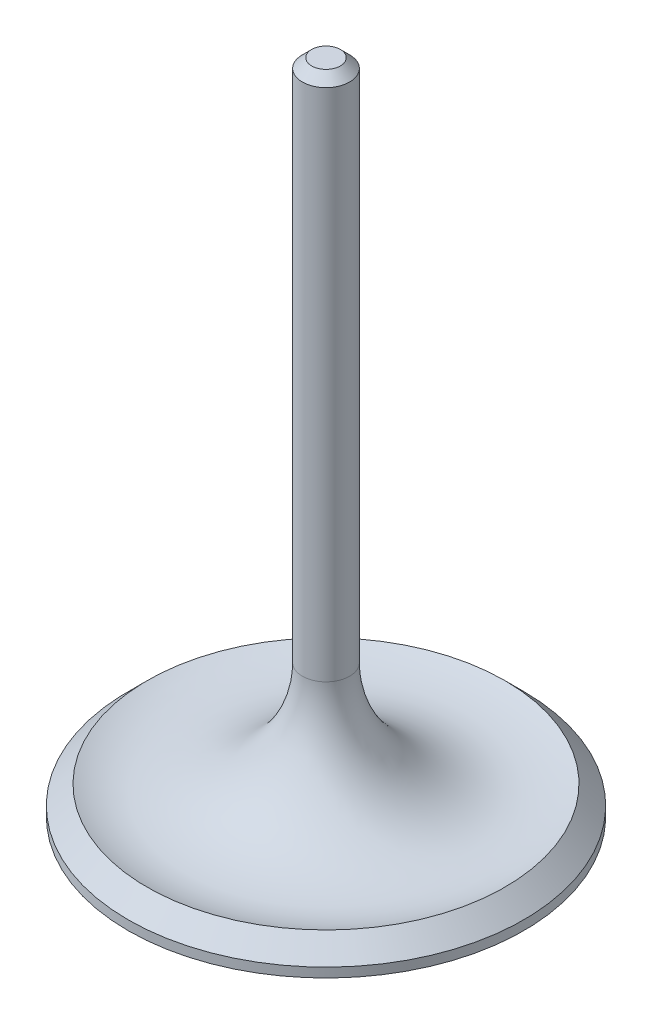
ISO-10303-21;
HEADER;
FILE_DESCRIPTION(('STEP AP214'),'2;1');
FILE_NAME('part.step','',(''),(''),'','','');
FILE_SCHEMA(('AUTOMOTIVE_DESIGN { 1 0 10303 214 1 1 1 1 }'));
ENDSEC;
DATA;
#1=APPLICATION_CONTEXT('core data for automotive mechanical design processes');
#2=APPLICATION_PROTOCOL_DEFINITION('international standard','automotive_design',2000,#1);
#3=PRODUCT_CONTEXT('',#1,'mechanical');
#4=PRODUCT('Part','Part','',(#3));
#5=PRODUCT_RELATED_PRODUCT_CATEGORY('part','',(#4));
#6=PRODUCT_DEFINITION_FORMATION('','',#4);
#7=PRODUCT_DEFINITION_CONTEXT('part definition',#1,'design');
#8=PRODUCT_DEFINITION('design','',#6,#7);
#9=PRODUCT_DEFINITION_SHAPE('','',#8);
#10=(LENGTH_UNIT() NAMED_UNIT(*) SI_UNIT(.MILLI.,.METRE.));
#11=(NAMED_UNIT(*) PLANE_ANGLE_UNIT() SI_UNIT($,.RADIAN.));
#12=(NAMED_UNIT(*) SI_UNIT($,.STERADIAN.) SOLID_ANGLE_UNIT());
#13=UNCERTAINTY_MEASURE_WITH_UNIT(LENGTH_MEASURE(1.E-05),#10,'distance_accuracy_value','');
#14=(GEOMETRIC_REPRESENTATION_CONTEXT(3) GLOBAL_UNCERTAINTY_ASSIGNED_CONTEXT((#13)) GLOBAL_UNIT_ASSIGNED_CONTEXT((#10,
#11,#12)) REPRESENTATION_CONTEXT('',''));
#15=CARTESIAN_POINT('',(0.,0.,0.));
#16=DIRECTION('',(0.,0.,1.));
#17=DIRECTION('',(1.,0.,0.));
#18=AXIS2_PLACEMENT_3D('',#15,#16,#17);
#19=CARTESIAN_POINT('',(0.,0.,-26.65));
#20=DIRECTION('',(0.,-1.,0.));
#21=DIRECTION('',(0.,0.,-1.));
#22=AXIS2_PLACEMENT_3D('',#19,#20,#21);
#23=PLANE('',#22);
#24=CARTESIAN_POINT('',(0.,0.,0.));
#25=DIRECTION('',(0.,-1.,0.));
#26=DIRECTION('',(0.,0.,-1.));
#27=AXIS2_PLACEMENT_3D('',#24,#25,#26);
#28=CIRCLE('',#27,26.65);
#29=CARTESIAN_POINT('',(0.,0.,-26.65));
#30=VERTEX_POINT('',#29);
#31=EDGE_CURVE('E45',#30,#30,#28,.T.);
#32=ORIENTED_EDGE('',*,*,#31,.T.);
#33=EDGE_LOOP('',(#32));
#34=FACE_BOUND('',#33,.T.);
#35=ADVANCED_FACE('F33',(#34),#23,.T.);
#36=CARTESIAN_POINT('',(0.,0.,0.));
#37=DIRECTION('',(0.,-1.,0.));
#38=DIRECTION('',(0.,0.,-1.));
#39=AXIS2_PLACEMENT_3D('',#36,#37,#38);
#40=CYLINDRICAL_SURFACE('',#39,26.65);
#41=CARTESIAN_POINT('',(0.,1.27,0.));
#42=DIRECTION('',(0.,-1.,0.));
#43=DIRECTION('',(0.,0.,-1.));
#44=AXIS2_PLACEMENT_3D('',#41,#42,#43);
#45=CIRCLE('',#44,26.65);
#46=CARTESIAN_POINT('',(0.,1.27,-26.65));
#47=VERTEX_POINT('',#46);
#48=EDGE_CURVE('E49',#47,#47,#45,.T.);
#49=ORIENTED_EDGE('',*,*,#48,.T.);
#50=EDGE_LOOP('',(#49));
#51=FACE_BOUND('',#50,.T.);
#52=ORIENTED_EDGE('',*,*,#31,.F.);
#53=EDGE_LOOP('',(#52));
#54=FACE_BOUND('',#53,.T.);
#55=ADVANCED_FACE('F76',(#51,#54),#40,.T.);
#56=CARTESIAN_POINT('',(0.,1.27,0.));
#57=DIRECTION('',(0.,-1.,0.));
#58=DIRECTION('',(0.,0.,-1.));
#59=AXIS2_PLACEMENT_3D('',#56,#57,#58);
#60=CONICAL_SURFACE('',#59,26.65,0.785398163397454);
#61=CARTESIAN_POINT('',(0.,3.81,0.));
#62=DIRECTION('',(0.,-1.,0.));
#63=DIRECTION('',(0.,0.,-1.));
#64=AXIS2_PLACEMENT_3D('',#61,#62,#63);
#65=CIRCLE('',#64,24.11);
#66=CARTESIAN_POINT('',(0.,3.81,-24.11));
#67=VERTEX_POINT('',#66);
#68=EDGE_CURVE('E54',#67,#67,#65,.T.);
#69=ORIENTED_EDGE('',*,*,#68,.T.);
#70=EDGE_LOOP('',(#69));
#71=FACE_BOUND('',#70,.T.);
#72=ORIENTED_EDGE('',*,*,#48,.F.);
#73=EDGE_LOOP('',(#72));
#74=FACE_BOUND('',#73,.T.);
#75=ADVANCED_FACE('F73',(#71,#74),#60,.T.);
#76=CARTESIAN_POINT('',(0.,17.9627417838382,0.));
#77=DIRECTION('',(0.,-1.,0.));
#78=DIRECTION('',(0.,0.,-1.));
#79=AXIS2_PLACEMENT_3D('',#76,#77,#78);
#80=TOROIDAL_SURFACE('',#79,18.43,15.25);
#81=CARTESIAN_POINT('',(0.,17.9627417838382,0.));
#82=DIRECTION('',(0.,-1.,0.));
#83=DIRECTION('',(0.,0.,-1.));
#84=AXIS2_PLACEMENT_3D('',#81,#82,#83);
#85=CIRCLE('',#84,3.18000000000001);
#86=CARTESIAN_POINT('',(0.,17.9627417838382,-3.18000000000001));
#87=VERTEX_POINT('',#86);
#88=EDGE_CURVE('E57',#87,#87,#85,.T.);
#89=ORIENTED_EDGE('',*,*,#88,.T.);
#90=EDGE_LOOP('',(#89));
#91=FACE_BOUND('',#90,.T.);
#92=ORIENTED_EDGE('',*,*,#68,.F.);
#93=EDGE_LOOP('',(#92));
#94=FACE_BOUND('',#93,.T.);
#95=ADVANCED_FACE('F61',(#91,#94),#80,.F.);
#96=CARTESIAN_POINT('',(0.,0.,0.));
#97=DIRECTION('',(0.,-1.,0.));
#98=DIRECTION('',(0.,0.,-1.));
#99=AXIS2_PLACEMENT_3D('',#96,#97,#98);
#100=CYLINDRICAL_SURFACE('',#99,3.18000000000001);
#101=CARTESIAN_POINT('',(0.,87.3,0.));
#102=DIRECTION('',(0.,1.,0.));
#103=DIRECTION('',(0.,0.,1.));
#104=AXIS2_PLACEMENT_3D('',#101,#102,#103);
#105=CIRCLE('',#104,3.18000000000001);
#106=CARTESIAN_POINT('',(0.,87.3,3.18000000000001));
#107=VERTEX_POINT('',#106);
#108=EDGE_CURVE('E41',#107,#107,#105,.F.);
#109=ORIENTED_EDGE('',*,*,#108,.T.);
#110=EDGE_LOOP('',(#109));
#111=FACE_BOUND('',#110,.T.);
#112=ORIENTED_EDGE('',*,*,#88,.F.);
#113=EDGE_LOOP('',(#112));
#114=FACE_BOUND('',#113,.T.);
#115=ADVANCED_FACE('F64',(#111,#114),#100,.T.);
#116=CARTESIAN_POINT('',(0.,88.55,0.));
#117=DIRECTION('',(0.,1.,0.));
#118=DIRECTION('',(0.,0.,1.));
#119=AXIS2_PLACEMENT_3D('',#116,#117,#118);
#120=PLANE('',#119);
#121=CARTESIAN_POINT('',(0.,88.55,0.));
#122=DIRECTION('',(0.,1.,0.));
#123=DIRECTION('',(0.,0.,1.));
#124=AXIS2_PLACEMENT_3D('',#121,#122,#123);
#125=CIRCLE('',#124,1.93);
#126=CARTESIAN_POINT('',(0.,88.55,1.93));
#127=VERTEX_POINT('',#126);
#128=EDGE_CURVE('E10',#127,#127,#125,.T.);
#129=ORIENTED_EDGE('',*,*,#128,.T.);
#130=EDGE_LOOP('',(#129));
#131=FACE_BOUND('',#130,.T.);
#132=ADVANCED_FACE('F66',(#131),#120,.T.);
#133=CARTESIAN_POINT('',(0.,87.3,0.));
#134=DIRECTION('',(0.,-1.,0.));
#135=DIRECTION('',(0.,0.,-1.));
#136=AXIS2_PLACEMENT_3D('',#133,#134,#135);
#137=CONICAL_SURFACE('',#136,3.18000000000001,0.785398163397444);
#138=ORIENTED_EDGE('',*,*,#128,.F.);
#139=EDGE_LOOP('',(#138));
#140=FACE_BOUND('',#139,.T.);
#141=ORIENTED_EDGE('',*,*,#108,.F.);
#142=EDGE_LOOP('',(#141));
#143=FACE_BOUND('',#142,.T.);
#144=ADVANCED_FACE('F36',(#140,#143),#137,.T.);
#145=CLOSED_SHELL('',(#35,#55,#75,#95,#115,#132,#144));
#146=MANIFOLD_SOLID_BREP('B2',#145);
#147=ADVANCED_BREP_SHAPE_REPRESENTATION('',(#18,#146),#14);
#148=SHAPE_DEFINITION_REPRESENTATION(#9,#147);
ENDSEC;
END-ISO-10303-21;
